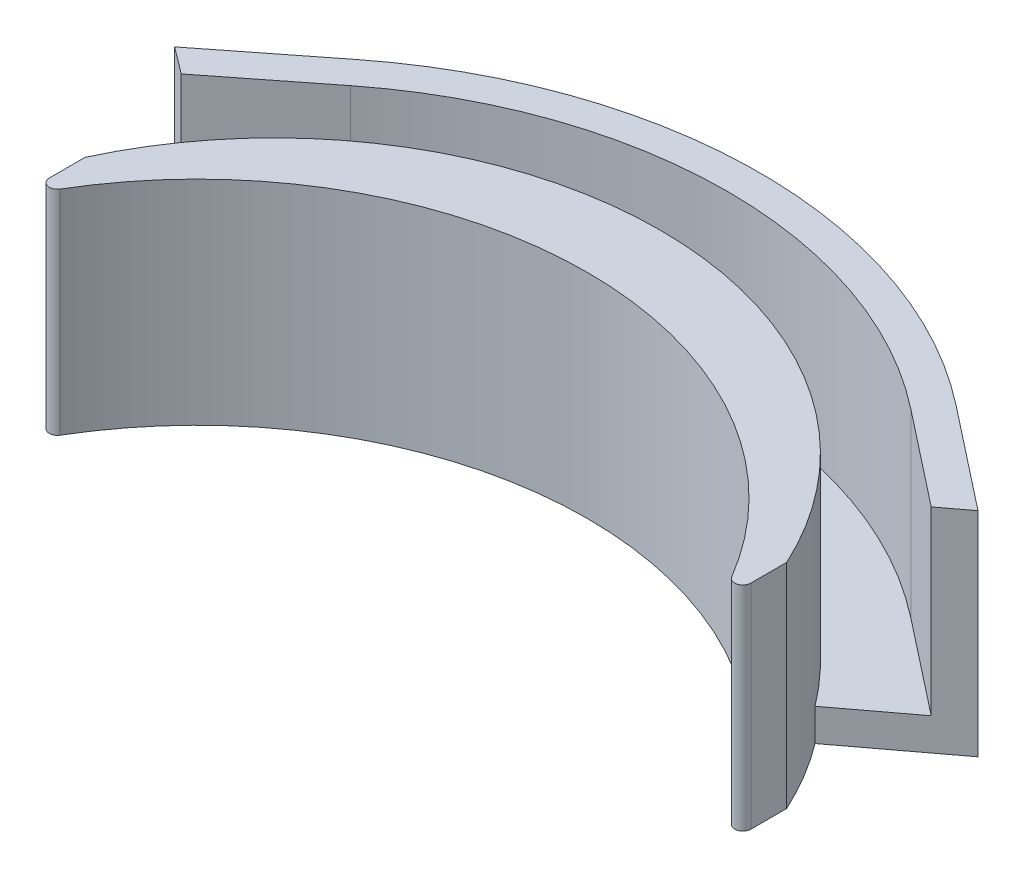
ISO-10303-21;
HEADER;
FILE_DESCRIPTION(('STEP AP214'),'2;1');
FILE_NAME('part.step','',(''),(''),'','','');
FILE_SCHEMA(('AUTOMOTIVE_DESIGN { 1 0 10303 214 1 1 1 1 }'));
ENDSEC;
DATA;
#1=APPLICATION_CONTEXT('core data for automotive mechanical design processes');
#2=APPLICATION_PROTOCOL_DEFINITION('international standard','automotive_design',2000,#1);
#3=PRODUCT_CONTEXT('',#1,'mechanical');
#4=PRODUCT('Part','Part','',(#3));
#5=PRODUCT_RELATED_PRODUCT_CATEGORY('part','',(#4));
#6=PRODUCT_DEFINITION_FORMATION('','',#4);
#7=PRODUCT_DEFINITION_CONTEXT('part definition',#1,'design');
#8=PRODUCT_DEFINITION('design','',#6,#7);
#9=PRODUCT_DEFINITION_SHAPE('','',#8);
#10=(LENGTH_UNIT() NAMED_UNIT(*) SI_UNIT(.MILLI.,.METRE.));
#11=(NAMED_UNIT(*) PLANE_ANGLE_UNIT() SI_UNIT($,.RADIAN.));
#12=(NAMED_UNIT(*) SI_UNIT($,.STERADIAN.) SOLID_ANGLE_UNIT());
#13=UNCERTAINTY_MEASURE_WITH_UNIT(LENGTH_MEASURE(1.E-05),#10,'distance_accuracy_value','');
#14=(GEOMETRIC_REPRESENTATION_CONTEXT(3) GLOBAL_UNCERTAINTY_ASSIGNED_CONTEXT((#13)) GLOBAL_UNIT_ASSIGNED_CONTEXT((#10,
#11,#12)) REPRESENTATION_CONTEXT('',''));
#15=CARTESIAN_POINT('',(0.,0.,0.));
#16=DIRECTION('',(0.,0.,1.));
#17=DIRECTION('',(1.,0.,0.));
#18=AXIS2_PLACEMENT_3D('',#15,#16,#17);
#19=CARTESIAN_POINT('',(0.,-3.175,0.));
#20=DIRECTION('',(-0.601208888266739,0.,-0.799091905020362));
#21=DIRECTION('',(-0.799091905020362,0.,0.601208888266739));
#22=AXIS2_PLACEMENT_3D('',#19,#20,#21);
#23=PLANE('',#22);
#24=DIRECTION('',(0.,1.,0.));
#25=VECTOR('',#24,1.);
#26=CARTESIAN_POINT('',(39.4847110981984,-3.175,-29.7069199596964));
#27=LINE('',#26,#25);
#28=CARTESIAN_POINT('',(39.4847110981984,-3.175,-29.7069199596964));
#29=VERTEX_POINT('',#28);
#30=CARTESIAN_POINT('',(39.4847110981984,17.78,-29.7069199596964));
#31=VERTEX_POINT('',#30);
#32=EDGE_CURVE('E275',#29,#31,#27,.T.);
#33=ORIENTED_EDGE('',*,*,#32,.T.);
#34=DIRECTION('',(-0.799091905020362,0.,0.601208888266739));
#35=VECTOR('',#34,1.);
#36=CARTESIAN_POINT('',(0.,17.78,0.));
#37=LINE('',#36,#35);
#38=CARTESIAN_POINT('',(36.8593978602862,17.78,-27.73172581344));
#39=VERTEX_POINT('',#38);
#40=EDGE_CURVE('E231',#31,#39,#37,.T.);
#41=ORIENTED_EDGE('',*,*,#40,.T.);
#42=DIRECTION('',(0.,-1.,0.));
#43=VECTOR('',#42,1.);
#44=CARTESIAN_POINT('',(36.8593978602862,17.78,-27.73172581344));
#45=LINE('',#44,#43);
#46=CARTESIAN_POINT('',(36.8593978602862,0.,-27.73172581344));
#47=VERTEX_POINT('',#46);
#48=EDGE_CURVE('E243',#39,#47,#45,.T.);
#49=ORIENTED_EDGE('',*,*,#48,.T.);
#50=DIRECTION('',(-0.799091905020362,0.,0.601208888266739));
#51=VECTOR('',#50,1.);
#52=CARTESIAN_POINT('',(0.,0.,0.));
#53=LINE('',#52,#51);
#54=CARTESIAN_POINT('',(30.3439169093382,0.,-22.8297051141529));
#55=VERTEX_POINT('',#54);
#56=EDGE_CURVE('E257',#47,#55,#53,.T.);
#57=ORIENTED_EDGE('',*,*,#56,.T.);
#58=DIRECTION('',(0.,1.,0.));
#59=VECTOR('',#58,1.);
#60=CARTESIAN_POINT('',(30.3439169093382,-3.175,-22.8297051141529));
#61=LINE('',#60,#59);
#62=CARTESIAN_POINT('',(30.3439169093382,-3.175,-22.8297051141529));
#63=VERTEX_POINT('',#62);
#64=EDGE_CURVE('E261',#63,#55,#61,.T.);
#65=ORIENTED_EDGE('',*,*,#64,.F.);
#66=DIRECTION('',(-0.799091905020362,0.,0.601208888266739));
#67=VECTOR('',#66,1.);
#68=CARTESIAN_POINT('',(0.,-3.175,0.));
#69=LINE('',#68,#67);
#70=EDGE_CURVE('E262',#29,#63,#69,.T.);
#71=ORIENTED_EDGE('',*,*,#70,.F.);
#72=EDGE_LOOP('',(#33,#41,#49,#57,#65,#71));
#73=FACE_BOUND('',#72,.T.);
#74=ADVANCED_FACE('F68',(#73),#23,.F.);
#75=CARTESIAN_POINT('',(0.,-3.175,0.));
#76=DIRECTION('',(0.,1.,0.));
#77=DIRECTION('',(0.,0.,1.));
#78=AXIS2_PLACEMENT_3D('',#75,#76,#77);
#79=CYLINDRICAL_SURFACE('',#78,37.973);
#80=ORIENTED_EDGE('',*,*,#64,.T.);
#81=CARTESIAN_POINT('',(0.,0.,0.));
#82=DIRECTION('',(0.,1.,0.));
#83=DIRECTION('',(0.,0.,1.));
#84=AXIS2_PLACEMENT_3D('',#81,#82,#83);
#85=CIRCLE('',#84,37.973);
#86=CARTESIAN_POINT('',(-30.3439169093382,0.,-22.8297051141529));
#87=VERTEX_POINT('',#86);
#88=EDGE_CURVE('E258',#55,#87,#85,.T.);
#89=ORIENTED_EDGE('',*,*,#88,.T.);
#90=DIRECTION('',(0.,1.,0.));
#91=VECTOR('',#90,1.);
#92=CARTESIAN_POINT('',(-30.3439169093382,-3.175,-22.8297051141529));
#93=LINE('',#92,#91);
#94=CARTESIAN_POINT('',(-30.3439169093382,-3.175,-22.8297051141529));
#95=VERTEX_POINT('',#94);
#96=EDGE_CURVE('E222',#95,#87,#93,.T.);
#97=ORIENTED_EDGE('',*,*,#96,.F.);
#98=CARTESIAN_POINT('',(0.,-3.175,0.));
#99=DIRECTION('',(0.,-1.,0.));
#100=DIRECTION('',(0.,0.,1.));
#101=AXIS2_PLACEMENT_3D('',#98,#99,#100);
#102=CIRCLE('',#101,37.973);
#103=CARTESIAN_POINT('',(-34.4809472956851,-3.175,-15.9063824483189));
#104=VERTEX_POINT('',#103);
#105=EDGE_CURVE('E210',#104,#95,#102,.T.);
#106=ORIENTED_EDGE('',*,*,#105,.F.);
#107=DIRECTION('',(0.,1.,0.));
#108=VECTOR('',#107,1.);
#109=CARTESIAN_POINT('',(-34.4809472956851,-3.175,-15.9063824483189));
#110=LINE('',#109,#108);
#111=CARTESIAN_POINT('',(-34.4809472956851,17.78,-15.9063824483189));
#112=VERTEX_POINT('',#111);
#113=EDGE_CURVE('E212',#104,#112,#110,.T.);
#114=ORIENTED_EDGE('',*,*,#113,.T.);
#115=CARTESIAN_POINT('',(0.,17.78,0.));
#116=DIRECTION('',(0.,1.,0.));
#117=DIRECTION('',(0.,0.,1.));
#118=AXIS2_PLACEMENT_3D('',#115,#116,#117);
#119=CIRCLE('',#118,37.973);
#120=CARTESIAN_POINT('',(34.4809472956851,17.78,-15.9063824483189));
#121=VERTEX_POINT('',#120);
#122=EDGE_CURVE('E253',#121,#112,#119,.T.);
#123=ORIENTED_EDGE('',*,*,#122,.F.);
#124=DIRECTION('',(0.,1.,0.));
#125=VECTOR('',#124,1.);
#126=CARTESIAN_POINT('',(34.4809472956851,-3.175,-15.9063824483189));
#127=LINE('',#126,#125);
#128=CARTESIAN_POINT('',(34.4809472956851,-3.175,-15.9063824483189));
#129=VERTEX_POINT('',#128);
#130=EDGE_CURVE('E279',#129,#121,#127,.T.);
#131=ORIENTED_EDGE('',*,*,#130,.F.);
#132=CARTESIAN_POINT('',(0.,-3.175,0.));
#133=DIRECTION('',(0.,1.,0.));
#134=DIRECTION('',(0.,0.,1.));
#135=AXIS2_PLACEMENT_3D('',#132,#133,#134);
#136=CIRCLE('',#135,37.973);
#137=EDGE_CURVE('E272',#129,#63,#136,.T.);
#138=ORIENTED_EDGE('',*,*,#137,.T.);
#139=EDGE_LOOP('',(#80,#89,#97,#106,#114,#123,#131,#138));
#140=FACE_BOUND('',#139,.T.);
#141=ADVANCED_FACE('F317',(#140),#79,.T.);
#142=CARTESIAN_POINT('',(34.4809472956851,-3.175,0.));
#143=DIRECTION('',(1.,0.,0.));
#144=DIRECTION('',(0.,0.,-1.));
#145=AXIS2_PLACEMENT_3D('',#142,#143,#144);
#146=PLANE('',#145);
#147=DIRECTION('',(0.,0.,-1.));
#148=VECTOR('',#147,1.);
#149=CARTESIAN_POINT('',(34.4809472956851,17.78,0.));
#150=LINE('',#149,#148);
#151=CARTESIAN_POINT('',(34.4809472956851,17.78,-12.3863951866094));
#152=VERTEX_POINT('',#151);
#153=EDGE_CURVE('E251',#152,#121,#150,.T.);
#154=ORIENTED_EDGE('',*,*,#153,.F.);
#155=DIRECTION('',(0.,-1.,0.));
#156=VECTOR('',#155,1.);
#157=CARTESIAN_POINT('',(34.4809472956851,-3.175,-12.3863951866094));
#158=LINE('',#157,#156);
#159=CARTESIAN_POINT('',(34.4809472956851,-3.175,-12.3863951866094));
#160=VERTEX_POINT('',#159);
#161=EDGE_CURVE('E76',#152,#160,#158,.T.);
#162=ORIENTED_EDGE('',*,*,#161,.T.);
#163=DIRECTION('',(0.,0.,-1.));
#164=VECTOR('',#163,1.);
#165=CARTESIAN_POINT('',(34.4809472956851,-3.175,0.));
#166=LINE('',#165,#164);
#167=EDGE_CURVE('E270',#160,#129,#166,.T.);
#168=ORIENTED_EDGE('',*,*,#167,.T.);
#169=ORIENTED_EDGE('',*,*,#130,.T.);
#170=EDGE_LOOP('',(#154,#162,#168,#169));
#171=FACE_BOUND('',#170,.T.);
#172=ADVANCED_FACE('F322',(#171),#146,.T.);
#173=CARTESIAN_POINT('',(0.,-3.175,7.5565));
#174=DIRECTION('',(0.,1.,0.));
#175=DIRECTION('',(0.,0.,1.));
#176=AXIS2_PLACEMENT_3D('',#173,#174,#175);
#177=CYLINDRICAL_SURFACE('',#176,38.354);
#178=CARTESIAN_POINT('',(0.,-3.175,7.5565));
#179=DIRECTION('',(0.,1.,0.));
#180=DIRECTION('',(0.,0.,1.));
#181=AXIS2_PLACEMENT_3D('',#178,#179,#180);
#182=CIRCLE('',#181,38.354);
#183=CARTESIAN_POINT('',(33.0041640982868,-3.175,-11.9820380254859));
#184=VERTEX_POINT('',#183);
#185=CARTESIAN_POINT('',(-33.0041640982868,-3.175,-11.9820380254859));
#186=VERTEX_POINT('',#185);
#187=EDGE_CURVE('E268',#184,#186,#182,.T.);
#188=ORIENTED_EDGE('',*,*,#187,.F.);
#189=DIRECTION('',(0.,1.,0.));
#190=VECTOR('',#189,1.);
#191=CARTESIAN_POINT('',(33.0041640982868,-3.175,-11.9820380254859));
#192=LINE('',#191,#190);
#193=CARTESIAN_POINT('',(33.0041640982868,17.78,-11.9820380254859));
#194=VERTEX_POINT('',#193);
#195=EDGE_CURVE('E260',#184,#194,#192,.T.);
#196=ORIENTED_EDGE('',*,*,#195,.T.);
#197=CARTESIAN_POINT('',(0.,17.78,7.5565));
#198=DIRECTION('',(0.,1.,0.));
#199=DIRECTION('',(0.,0.,1.));
#200=AXIS2_PLACEMENT_3D('',#197,#198,#199);
#201=CIRCLE('',#200,38.354);
#202=CARTESIAN_POINT('',(-33.0041640982868,17.78,-11.9820380254859));
#203=VERTEX_POINT('',#202);
#204=EDGE_CURVE('E255',#194,#203,#201,.T.);
#205=ORIENTED_EDGE('',*,*,#204,.T.);
#206=DIRECTION('',(0.,1.,0.));
#207=VECTOR('',#206,1.);
#208=CARTESIAN_POINT('',(-33.0041640982868,-3.175,-11.9820380254859));
#209=LINE('',#208,#207);
#210=EDGE_CURVE('E218',#186,#203,#209,.T.);
#211=ORIENTED_EDGE('',*,*,#210,.F.);
#212=EDGE_LOOP('',(#188,#196,#205,#211));
#213=FACE_BOUND('',#212,.T.);
#214=ADVANCED_FACE('F290',(#213),#177,.F.);
#215=CARTESIAN_POINT('',(0.,-3.175,0.));
#216=DIRECTION('',(0.,1.,0.));
#217=DIRECTION('',(0.,0.,1.));
#218=AXIS2_PLACEMENT_3D('',#215,#216,#217);
#219=CYLINDRICAL_SURFACE('',#218,47.752);
#220=CARTESIAN_POINT('',(0.,-3.175,0.));
#221=DIRECTION('',(0.,1.,0.));
#222=DIRECTION('',(0.,0.,1.));
#223=AXIS2_PLACEMENT_3D('',#220,#221,#222);
#224=CIRCLE('',#223,47.752);
#225=CARTESIAN_POINT('',(29.4974786342241,-3.175,-37.5519940645433));
#226=VERTEX_POINT('',#225);
#227=CARTESIAN_POINT('',(-29.4974786342241,-3.175,-37.5519940645432));
#228=VERTEX_POINT('',#227);
#229=EDGE_CURVE('E266',#226,#228,#224,.T.);
#230=ORIENTED_EDGE('',*,*,#229,.T.);
#231=DIRECTION('',(0.,1.,0.));
#232=VECTOR('',#231,1.);
#233=CARTESIAN_POINT('',(-29.4974786342241,-3.175,-37.5519940645432));
#234=LINE('',#233,#232);
#235=CARTESIAN_POINT('',(-29.4974786342241,17.78,-37.5519940645432));
#236=VERTEX_POINT('',#235);
#237=EDGE_CURVE('E209',#228,#236,#234,.T.);
#238=ORIENTED_EDGE('',*,*,#237,.T.);
#239=CARTESIAN_POINT('',(0.,17.78,0.));
#240=DIRECTION('',(0.,1.,0.));
#241=DIRECTION('',(0.,0.,1.));
#242=AXIS2_PLACEMENT_3D('',#239,#240,#241);
#243=CIRCLE('',#242,47.752);
#244=CARTESIAN_POINT('',(29.4974786342241,17.78,-37.5519940645433));
#245=VERTEX_POINT('',#244);
#246=EDGE_CURVE('E188',#245,#236,#243,.T.);
#247=ORIENTED_EDGE('',*,*,#246,.F.);
#248=DIRECTION('',(0.,1.,0.));
#249=VECTOR('',#248,1.);
#250=CARTESIAN_POINT('',(29.4974786342241,-3.175,-37.5519940645433));
#251=LINE('',#250,#249);
#252=EDGE_CURVE('E282',#226,#245,#251,.T.);
#253=ORIENTED_EDGE('',*,*,#252,.F.);
#254=EDGE_LOOP('',(#230,#238,#247,#253));
#255=FACE_BOUND('',#254,.T.);
#256=ADVANCED_FACE('F329',(#255),#219,.T.);
#257=CARTESIAN_POINT('',(29.4974786342241,-3.175,-37.5519940645433));
#258=DIRECTION('',(-0.617722370460381,0.,0.786396257005848));
#259=DIRECTION('',(0.786396257005848,0.,0.617722370460381));
#260=AXIS2_PLACEMENT_3D('',#257,#258,#259);
#261=PLANE('',#260);
#262=ORIENTED_EDGE('',*,*,#252,.T.);
#263=DIRECTION('',(0.786396257005848,0.,0.617722370460381));
#264=VECTOR('',#263,1.);
#265=CARTESIAN_POINT('',(29.4974786342241,17.78,-37.5519940645433));
#266=LINE('',#265,#264);
#267=EDGE_CURVE('E234',#245,#31,#266,.T.);
#268=ORIENTED_EDGE('',*,*,#267,.T.);
#269=ORIENTED_EDGE('',*,*,#32,.F.);
#270=DIRECTION('',(0.786396257005848,0.,0.617722370460381));
#271=VECTOR('',#270,1.);
#272=CARTESIAN_POINT('',(29.4974786342241,-3.175,-37.5519940645433));
#273=LINE('',#272,#271);
#274=EDGE_CURVE('E264',#226,#29,#273,.T.);
#275=ORIENTED_EDGE('',*,*,#274,.F.);
#276=EDGE_LOOP('',(#262,#268,#269,#275));
#277=FACE_BOUND('',#276,.T.);
#278=ADVANCED_FACE('F326',(#277),#261,.F.);
#279=CARTESIAN_POINT('',(0.,-3.175,0.));
#280=DIRECTION('',(0.,1.,0.));
#281=DIRECTION('',(0.,0.,1.));
#282=AXIS2_PLACEMENT_3D('',#279,#280,#281);
#283=PLANE('',#282);
#284=ORIENTED_EDGE('',*,*,#167,.F.);
#285=CARTESIAN_POINT('',(33.6871972956851,-3.175,-12.3863951866094));
#286=DIRECTION('',(0.,1.,0.));
#287=DIRECTION('',(0.,0.,1.));
#288=AXIS2_PLACEMENT_3D('',#285,#286,#287);
#289=CIRCLE('',#288,0.79375);
#290=EDGE_CURVE('E12',#160,#184,#289,.F.);
#291=ORIENTED_EDGE('',*,*,#290,.T.);
#292=ORIENTED_EDGE('',*,*,#187,.T.);
#293=CARTESIAN_POINT('',(-33.6871972956851,-3.175,-12.3863951866094));
#294=DIRECTION('',(0.,-1.,0.));
#295=DIRECTION('',(0.,0.,1.));
#296=AXIS2_PLACEMENT_3D('',#293,#294,#295);
#297=CIRCLE('',#296,0.79375);
#298=CARTESIAN_POINT('',(-34.4809472956851,-3.175,-12.3863951866094));
#299=VERTEX_POINT('',#298);
#300=EDGE_CURVE('E227',#299,#186,#297,.F.);
#301=ORIENTED_EDGE('',*,*,#300,.F.);
#302=DIRECTION('',(0.,0.,-1.));
#303=VECTOR('',#302,1.);
#304=CARTESIAN_POINT('',(-34.4809472956851,-3.175,0.));
#305=LINE('',#304,#303);
#306=EDGE_CURVE('E214',#299,#104,#305,.T.);
#307=ORIENTED_EDGE('',*,*,#306,.T.);
#308=ORIENTED_EDGE('',*,*,#105,.T.);
#309=DIRECTION('',(0.799091905020363,0.,0.601208888266738));
#310=VECTOR('',#309,1.);
#311=CARTESIAN_POINT('',(0.,-3.175,0.));
#312=LINE('',#311,#310);
#313=CARTESIAN_POINT('',(-39.4847110981984,-3.175,-29.7069199596964));
#314=VERTEX_POINT('',#313);
#315=EDGE_CURVE('E377',#314,#95,#312,.T.);
#316=ORIENTED_EDGE('',*,*,#315,.F.);
#317=DIRECTION('',(-0.786396257005848,0.,0.617722370460381));
#318=VECTOR('',#317,1.);
#319=CARTESIAN_POINT('',(-29.4974786342241,-3.175,-37.5519940645432));
#320=LINE('',#319,#318);
#321=EDGE_CURVE('E207',#228,#314,#320,.T.);
#322=ORIENTED_EDGE('',*,*,#321,.F.);
#323=ORIENTED_EDGE('',*,*,#229,.F.);
#324=ORIENTED_EDGE('',*,*,#274,.T.);
#325=ORIENTED_EDGE('',*,*,#70,.T.);
#326=ORIENTED_EDGE('',*,*,#137,.F.);
#327=EDGE_LOOP('',(#284,#291,#292,#301,#307,#308,#316,#322,#323,#324,#325,#326));
#328=FACE_BOUND('',#327,.T.);
#329=ADVANCED_FACE('F304',(#328),#283,.F.);
#330=CARTESIAN_POINT('',(0.,0.,0.));
#331=DIRECTION('',(0.,1.,0.));
#332=DIRECTION('',(0.,0.,1.));
#333=AXIS2_PLACEMENT_3D('',#330,#331,#332);
#334=PLANE('',#333);
#335=CARTESIAN_POINT('',(0.,0.,0.));
#336=DIRECTION('',(0.,1.,0.));
#337=DIRECTION('',(0.,0.,1.));
#338=AXIS2_PLACEMENT_3D('',#335,#336,#337);
#339=CIRCLE('',#338,44.577);
#340=CARTESIAN_POINT('',(27.5362101080124,0.,-35.0551859485497));
#341=VERTEX_POINT('',#340);
#342=CARTESIAN_POINT('',(-27.5362101080124,0.,-35.0551859485497));
#343=VERTEX_POINT('',#342);
#344=EDGE_CURVE('E230',#341,#343,#339,.T.);
#345=ORIENTED_EDGE('',*,*,#344,.T.);
#346=DIRECTION('',(-0.786396257005848,0.,0.61772237046038));
#347=VECTOR('',#346,1.);
#348=CARTESIAN_POINT('',(-27.5362101080124,0.,-35.0551859485497));
#349=LINE('',#348,#347);
#350=CARTESIAN_POINT('',(-36.8593978602863,0.,-27.73172581344));
#351=VERTEX_POINT('',#350);
#352=EDGE_CURVE('E203',#343,#351,#349,.T.);
#353=ORIENTED_EDGE('',*,*,#352,.T.);
#354=DIRECTION('',(0.799091905020363,0.,0.601208888266738));
#355=VECTOR('',#354,1.);
#356=CARTESIAN_POINT('',(0.,0.,0.));
#357=LINE('',#356,#355);
#358=EDGE_CURVE('E376',#351,#87,#357,.T.);
#359=ORIENTED_EDGE('',*,*,#358,.T.);
#360=ORIENTED_EDGE('',*,*,#88,.F.);
#361=ORIENTED_EDGE('',*,*,#56,.F.);
#362=DIRECTION('',(0.786396257005849,0.,0.61772237046038));
#363=VECTOR('',#362,1.);
#364=CARTESIAN_POINT('',(27.5362101080123,0.,-35.0551859485497));
#365=LINE('',#364,#363);
#366=EDGE_CURVE('E235',#341,#47,#365,.T.);
#367=ORIENTED_EDGE('',*,*,#366,.F.);
#368=EDGE_LOOP('',(#345,#353,#359,#360,#361,#367));
#369=FACE_BOUND('',#368,.T.);
#370=ADVANCED_FACE('F338',(#369),#334,.T.);
#371=CARTESIAN_POINT('',(0.,17.78,0.));
#372=DIRECTION('',(0.,1.,0.));
#373=DIRECTION('',(0.,0.,1.));
#374=AXIS2_PLACEMENT_3D('',#371,#372,#373);
#375=PLANE('',#374);
#376=ORIENTED_EDGE('',*,*,#204,.F.);
#377=CARTESIAN_POINT('',(33.6871972956851,17.78,-12.3863951866094));
#378=DIRECTION('',(0.,1.,0.));
#379=DIRECTION('',(0.,0.,1.));
#380=AXIS2_PLACEMENT_3D('',#377,#378,#379);
#381=CIRCLE('',#380,0.79375);
#382=EDGE_CURVE('E90',#194,#152,#381,.T.);
#383=ORIENTED_EDGE('',*,*,#382,.T.);
#384=ORIENTED_EDGE('',*,*,#153,.T.);
#385=ORIENTED_EDGE('',*,*,#122,.T.);
#386=DIRECTION('',(0.,0.,-1.));
#387=VECTOR('',#386,1.);
#388=CARTESIAN_POINT('',(-34.4809472956851,17.78,0.));
#389=LINE('',#388,#387);
#390=CARTESIAN_POINT('',(-34.4809472956851,17.78,-12.3863951866094));
#391=VERTEX_POINT('',#390);
#392=EDGE_CURVE('E298',#391,#112,#389,.T.);
#393=ORIENTED_EDGE('',*,*,#392,.F.);
#394=CARTESIAN_POINT('',(-33.6871972956851,17.78,-12.3863951866094));
#395=DIRECTION('',(0.,-1.,0.));
#396=DIRECTION('',(0.,0.,1.));
#397=AXIS2_PLACEMENT_3D('',#394,#395,#396);
#398=CIRCLE('',#397,0.79375);
#399=EDGE_CURVE('E221',#203,#391,#398,.T.);
#400=ORIENTED_EDGE('',*,*,#399,.F.);
#401=EDGE_LOOP('',(#376,#383,#384,#385,#393,#400));
#402=FACE_BOUND('',#401,.T.);
#403=ADVANCED_FACE('F295',(#402),#375,.T.);
#404=CARTESIAN_POINT('',(0.,17.78,0.));
#405=DIRECTION('',(0.,-1.,0.));
#406=DIRECTION('',(0.,0.,-1.));
#407=AXIS2_PLACEMENT_3D('',#404,#405,#406);
#408=CYLINDRICAL_SURFACE('',#407,44.577);
#409=ORIENTED_EDGE('',*,*,#344,.F.);
#410=DIRECTION('',(0.,-1.,0.));
#411=VECTOR('',#410,1.);
#412=CARTESIAN_POINT('',(27.5362101080124,17.78,-35.0551859485497));
#413=LINE('',#412,#411);
#414=CARTESIAN_POINT('',(27.5362101080124,17.78,-35.0551859485497));
#415=VERTEX_POINT('',#414);
#416=EDGE_CURVE('E248',#415,#341,#413,.T.);
#417=ORIENTED_EDGE('',*,*,#416,.F.);
#418=CARTESIAN_POINT('',(0.,17.78,0.));
#419=DIRECTION('',(0.,1.,0.));
#420=DIRECTION('',(0.,0.,1.));
#421=AXIS2_PLACEMENT_3D('',#418,#419,#420);
#422=CIRCLE('',#421,44.577);
#423=CARTESIAN_POINT('',(-27.5362101080124,17.78,-35.0551859485497));
#424=VERTEX_POINT('',#423);
#425=EDGE_CURVE('E239',#415,#424,#422,.T.);
#426=ORIENTED_EDGE('',*,*,#425,.T.);
#427=DIRECTION('',(0.,-1.,0.));
#428=VECTOR('',#427,1.);
#429=CARTESIAN_POINT('',(-27.5362101080124,17.78,-35.0551859485497));
#430=LINE('',#429,#428);
#431=EDGE_CURVE('E368',#424,#343,#430,.T.);
#432=ORIENTED_EDGE('',*,*,#431,.T.);
#433=EDGE_LOOP('',(#409,#417,#426,#432));
#434=FACE_BOUND('',#433,.T.);
#435=ADVANCED_FACE('F346',(#434),#408,.F.);
#436=CARTESIAN_POINT('',(27.5362101080123,17.78,-35.0551859485497));
#437=DIRECTION('',(0.617722370460379,0.,-0.786396257005849));
#438=DIRECTION('',(-0.786396257005849,0.,-0.61772237046038));
#439=AXIS2_PLACEMENT_3D('',#436,#437,#438);
#440=PLANE('',#439);
#441=ORIENTED_EDGE('',*,*,#366,.T.);
#442=ORIENTED_EDGE('',*,*,#48,.F.);
#443=DIRECTION('',(0.786396257005849,0.,0.61772237046038));
#444=VECTOR('',#443,1.);
#445=CARTESIAN_POINT('',(27.5362101080123,17.78,-35.0551859485497));
#446=LINE('',#445,#444);
#447=EDGE_CURVE('E241',#415,#39,#446,.T.);
#448=ORIENTED_EDGE('',*,*,#447,.F.);
#449=ORIENTED_EDGE('',*,*,#416,.T.);
#450=EDGE_LOOP('',(#441,#442,#448,#449));
#451=FACE_BOUND('',#450,.T.);
#452=ADVANCED_FACE('F314',(#451),#440,.F.);
#453=CARTESIAN_POINT('',(0.,17.78,0.));
#454=DIRECTION('',(0.,1.,0.));
#455=DIRECTION('',(0.,0.,1.));
#456=AXIS2_PLACEMENT_3D('',#453,#454,#455);
#457=PLANE('',#456);
#458=ORIENTED_EDGE('',*,*,#40,.F.);
#459=ORIENTED_EDGE('',*,*,#267,.F.);
#460=ORIENTED_EDGE('',*,*,#246,.T.);
#461=DIRECTION('',(-0.786396257005848,0.,0.617722370460381));
#462=VECTOR('',#461,1.);
#463=CARTESIAN_POINT('',(-29.4974786342241,17.78,-37.5519940645432));
#464=LINE('',#463,#462);
#465=CARTESIAN_POINT('',(-39.4847110981984,17.78,-29.7069199596964));
#466=VERTEX_POINT('',#465);
#467=EDGE_CURVE('E179',#236,#466,#464,.T.);
#468=ORIENTED_EDGE('',*,*,#467,.T.);
#469=DIRECTION('',(0.799091905020363,0.,0.601208888266738));
#470=VECTOR('',#469,1.);
#471=CARTESIAN_POINT('',(0.,17.78,0.));
#472=LINE('',#471,#470);
#473=CARTESIAN_POINT('',(-36.8593978602863,17.78,-27.73172581344));
#474=VERTEX_POINT('',#473);
#475=EDGE_CURVE('E184',#466,#474,#472,.T.);
#476=ORIENTED_EDGE('',*,*,#475,.T.);
#477=DIRECTION('',(-0.786396257005848,0.,0.61772237046038));
#478=VECTOR('',#477,1.);
#479=CARTESIAN_POINT('',(-27.5362101080124,17.78,-35.0551859485497));
#480=LINE('',#479,#478);
#481=EDGE_CURVE('E193',#424,#474,#480,.T.);
#482=ORIENTED_EDGE('',*,*,#481,.F.);
#483=ORIENTED_EDGE('',*,*,#425,.F.);
#484=ORIENTED_EDGE('',*,*,#447,.T.);
#485=EDGE_LOOP('',(#458,#459,#460,#468,#476,#482,#483,#484));
#486=FACE_BOUND('',#485,.T.);
#487=ADVANCED_FACE('F182',(#486),#457,.T.);
#488=CARTESIAN_POINT('',(33.6871972956851,-3.175,-12.3863951866094));
#489=DIRECTION('',(0.,1.,0.));
#490=DIRECTION('',(0.,0.,1.));
#491=AXIS2_PLACEMENT_3D('',#488,#489,#490);
#492=CYLINDRICAL_SURFACE('',#491,0.79375);
#493=ORIENTED_EDGE('',*,*,#290,.F.);
#494=ORIENTED_EDGE('',*,*,#161,.F.);
#495=ORIENTED_EDGE('',*,*,#382,.F.);
#496=ORIENTED_EDGE('',*,*,#195,.F.);
#497=EDGE_LOOP('',(#493,#494,#495,#496));
#498=FACE_BOUND('',#497,.T.);
#499=ADVANCED_FACE('F70',(#498),#492,.T.);
#500=CARTESIAN_POINT('',(0.,-3.175,0.));
#501=DIRECTION('',(0.601208888266738,0.,-0.799091905020363));
#502=DIRECTION('',(0.799091905020363,0.,0.601208888266738));
#503=AXIS2_PLACEMENT_3D('',#500,#501,#502);
#504=PLANE('',#503);
#505=DIRECTION('',(0.,1.,0.));
#506=VECTOR('',#505,1.);
#507=CARTESIAN_POINT('',(-39.4847110981984,-3.175,-29.7069199596964));
#508=LINE('',#507,#506);
#509=EDGE_CURVE('E199',#314,#466,#508,.T.);
#510=ORIENTED_EDGE('',*,*,#509,.F.);
#511=ORIENTED_EDGE('',*,*,#315,.T.);
#512=ORIENTED_EDGE('',*,*,#96,.T.);
#513=ORIENTED_EDGE('',*,*,#358,.F.);
#514=DIRECTION('',(0.,-1.,0.));
#515=VECTOR('',#514,1.);
#516=CARTESIAN_POINT('',(-36.8593978602863,17.78,-27.73172581344));
#517=LINE('',#516,#515);
#518=EDGE_CURVE('E202',#474,#351,#517,.T.);
#519=ORIENTED_EDGE('',*,*,#518,.F.);
#520=ORIENTED_EDGE('',*,*,#475,.F.);
#521=EDGE_LOOP('',(#510,#511,#512,#513,#519,#520));
#522=FACE_BOUND('',#521,.T.);
#523=ADVANCED_FACE('F197',(#522),#504,.F.);
#524=CARTESIAN_POINT('',(-34.4809472956851,-3.175,0.));
#525=DIRECTION('',(-1.,0.,0.));
#526=DIRECTION('',(0.,0.,-1.));
#527=AXIS2_PLACEMENT_3D('',#524,#525,#526);
#528=PLANE('',#527);
#529=ORIENTED_EDGE('',*,*,#392,.T.);
#530=ORIENTED_EDGE('',*,*,#113,.F.);
#531=ORIENTED_EDGE('',*,*,#306,.F.);
#532=DIRECTION('',(0.,-1.,0.));
#533=VECTOR('',#532,1.);
#534=CARTESIAN_POINT('',(-34.4809472956851,-3.175,-12.3863951866094));
#535=LINE('',#534,#533);
#536=EDGE_CURVE('E224',#391,#299,#535,.T.);
#537=ORIENTED_EDGE('',*,*,#536,.F.);
#538=EDGE_LOOP('',(#529,#530,#531,#537));
#539=FACE_BOUND('',#538,.T.);
#540=ADVANCED_FACE('F312',(#539),#528,.T.);
#541=CARTESIAN_POINT('',(-29.4974786342241,-3.175,-37.5519940645432));
#542=DIRECTION('',(0.617722370460381,0.,0.786396257005848));
#543=DIRECTION('',(-0.786396257005848,0.,0.617722370460381));
#544=AXIS2_PLACEMENT_3D('',#541,#542,#543);
#545=PLANE('',#544);
#546=ORIENTED_EDGE('',*,*,#237,.F.);
#547=ORIENTED_EDGE('',*,*,#321,.T.);
#548=ORIENTED_EDGE('',*,*,#509,.T.);
#549=ORIENTED_EDGE('',*,*,#467,.F.);
#550=EDGE_LOOP('',(#546,#547,#548,#549));
#551=FACE_BOUND('',#550,.T.);
#552=ADVANCED_FACE('F205',(#551),#545,.F.);
#553=CARTESIAN_POINT('',(-27.5362101080124,17.78,-35.0551859485497));
#554=DIRECTION('',(-0.61772237046038,0.,-0.786396257005848));
#555=DIRECTION('',(0.786396257005848,0.,-0.61772237046038));
#556=AXIS2_PLACEMENT_3D('',#553,#554,#555);
#557=PLANE('',#556);
#558=ORIENTED_EDGE('',*,*,#352,.F.);
#559=ORIENTED_EDGE('',*,*,#431,.F.);
#560=ORIENTED_EDGE('',*,*,#481,.T.);
#561=ORIENTED_EDGE('',*,*,#518,.T.);
#562=EDGE_LOOP('',(#558,#559,#560,#561));
#563=FACE_BOUND('',#562,.T.);
#564=ADVANCED_FACE('F354',(#563),#557,.F.);
#565=CARTESIAN_POINT('',(-33.6871972956851,-3.175,-12.3863951866094));
#566=DIRECTION('',(0.,1.,0.));
#567=DIRECTION('',(0.,0.,1.));
#568=AXIS2_PLACEMENT_3D('',#565,#566,#567);
#569=CYLINDRICAL_SURFACE('',#568,0.79375);
#570=ORIENTED_EDGE('',*,*,#300,.T.);
#571=ORIENTED_EDGE('',*,*,#210,.T.);
#572=ORIENTED_EDGE('',*,*,#399,.T.);
#573=ORIENTED_EDGE('',*,*,#536,.T.);
#574=EDGE_LOOP('',(#570,#571,#572,#573));
#575=FACE_BOUND('',#574,.T.);
#576=ADVANCED_FACE('F301',(#575),#569,.T.);
#577=CLOSED_SHELL('',(#74,#141,#172,#214,#256,#278,#329,#370,#403,#435,#452,#487,#499,#523,#540,
#552,#564,#576));
#578=MANIFOLD_SOLID_BREP('B2',#577);
#579=ADVANCED_BREP_SHAPE_REPRESENTATION('',(#18,#578),#14);
#580=SHAPE_DEFINITION_REPRESENTATION(#9,#579);
ENDSEC;
END-ISO-10303-21;
